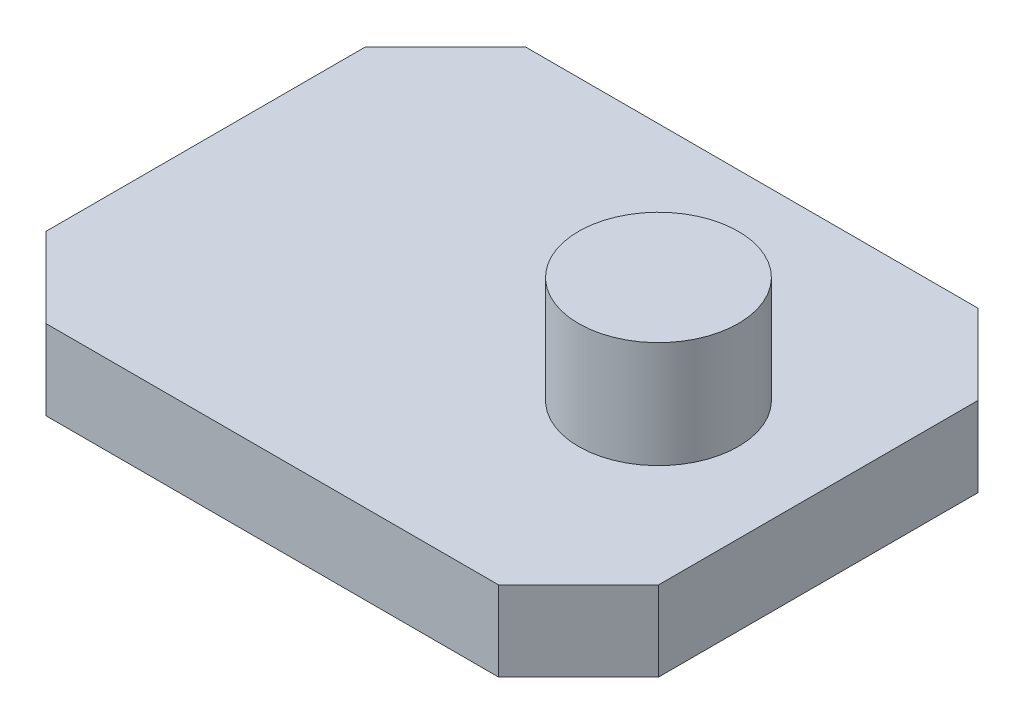
ISO-10303-21;
HEADER;
FILE_DESCRIPTION(('STEP AP214'),'2;1');
FILE_NAME('part.step','',(''),(''),'','','');
FILE_SCHEMA(('AUTOMOTIVE_DESIGN { 1 0 10303 214 1 1 1 1 }'));
ENDSEC;
DATA;
#1=APPLICATION_CONTEXT('core data for automotive mechanical design processes');
#2=APPLICATION_PROTOCOL_DEFINITION('international standard','automotive_design',2000,#1);
#3=PRODUCT_CONTEXT('',#1,'mechanical');
#4=PRODUCT('Part','Part','',(#3));
#5=PRODUCT_RELATED_PRODUCT_CATEGORY('part','',(#4));
#6=PRODUCT_DEFINITION_FORMATION('','',#4);
#7=PRODUCT_DEFINITION_CONTEXT('part definition',#1,'design');
#8=PRODUCT_DEFINITION('design','',#6,#7);
#9=PRODUCT_DEFINITION_SHAPE('','',#8);
#10=(LENGTH_UNIT() NAMED_UNIT(*) SI_UNIT(.MILLI.,.METRE.));
#11=(NAMED_UNIT(*) PLANE_ANGLE_UNIT() SI_UNIT($,.RADIAN.));
#12=(NAMED_UNIT(*) SI_UNIT($,.STERADIAN.) SOLID_ANGLE_UNIT());
#13=UNCERTAINTY_MEASURE_WITH_UNIT(LENGTH_MEASURE(1.E-05),#10,'distance_accuracy_value','');
#14=(GEOMETRIC_REPRESENTATION_CONTEXT(3) GLOBAL_UNCERTAINTY_ASSIGNED_CONTEXT((#13)) GLOBAL_UNIT_ASSIGNED_CONTEXT((#10,
#11,#12)) REPRESENTATION_CONTEXT('',''));
#15=CARTESIAN_POINT('',(0.,0.,0.));
#16=DIRECTION('',(0.,0.,1.));
#17=DIRECTION('',(1.,0.,0.));
#18=AXIS2_PLACEMENT_3D('',#15,#16,#17);
#19=CARTESIAN_POINT('',(11.5,1.5,-9.));
#20=DIRECTION('',(-1.,0.,0.));
#21=DIRECTION('',(0.,0.,1.));
#22=AXIS2_PLACEMENT_3D('',#19,#20,#21);
#23=PLANE('',#22);
#24=DIRECTION('',(0.,0.,-1.));
#25=VECTOR('',#24,1.);
#26=CARTESIAN_POINT('',(11.5,1.5,-9.));
#27=LINE('',#26,#25);
#28=CARTESIAN_POINT('',(11.5,1.5,6.));
#29=VERTEX_POINT('',#28);
#30=CARTESIAN_POINT('',(11.5,1.5,-5.99999999999999));
#31=VERTEX_POINT('',#30);
#32=EDGE_CURVE('E140',#29,#31,#27,.T.);
#33=ORIENTED_EDGE('',*,*,#32,.F.);
#34=DIRECTION('',(0.,-1.,0.));
#35=VECTOR('',#34,1.);
#36=CARTESIAN_POINT('',(11.5,1.5,6.));
#37=LINE('',#36,#35);
#38=CARTESIAN_POINT('',(11.5,-1.5,6.));
#39=VERTEX_POINT('',#38);
#40=EDGE_CURVE('E123',#29,#39,#37,.T.);
#41=ORIENTED_EDGE('',*,*,#40,.T.);
#42=DIRECTION('',(0.,0.,-1.));
#43=VECTOR('',#42,1.);
#44=CARTESIAN_POINT('',(11.5,-1.5,-9.));
#45=LINE('',#44,#43);
#46=CARTESIAN_POINT('',(11.5,-1.5,-5.99999999999999));
#47=VERTEX_POINT('',#46);
#48=EDGE_CURVE('E133',#39,#47,#45,.T.);
#49=ORIENTED_EDGE('',*,*,#48,.T.);
#50=DIRECTION('',(0.,1.,0.));
#51=VECTOR('',#50,1.);
#52=CARTESIAN_POINT('',(11.5,1.5,-5.99999999999999));
#53=LINE('',#52,#51);
#54=EDGE_CURVE('E137',#47,#31,#53,.T.);
#55=ORIENTED_EDGE('',*,*,#54,.T.);
#56=EDGE_LOOP('',(#33,#41,#49,#55));
#57=FACE_BOUND('',#56,.T.);
#58=ADVANCED_FACE('F50',(#57),#23,.F.);
#59=CARTESIAN_POINT('',(-11.5,1.5,-9.));
#60=DIRECTION('',(0.,0.,1.));
#61=DIRECTION('',(1.,0.,0.));
#62=AXIS2_PLACEMENT_3D('',#59,#60,#61);
#63=PLANE('',#62);
#64=DIRECTION('',(-1.,0.,0.));
#65=VECTOR('',#64,1.);
#66=CARTESIAN_POINT('',(-11.5,1.5,-9.));
#67=LINE('',#66,#65);
#68=CARTESIAN_POINT('',(8.49999999999999,1.5,-9.));
#69=VERTEX_POINT('',#68);
#70=CARTESIAN_POINT('',(-8.49999999999999,1.5,-9.));
#71=VERTEX_POINT('',#70);
#72=EDGE_CURVE('E215',#69,#71,#67,.T.);
#73=ORIENTED_EDGE('',*,*,#72,.F.);
#74=DIRECTION('',(0.,-1.,0.));
#75=VECTOR('',#74,1.);
#76=CARTESIAN_POINT('',(8.49999999999999,1.5,-9.));
#77=LINE('',#76,#75);
#78=CARTESIAN_POINT('',(8.49999999999999,-1.5,-9.));
#79=VERTEX_POINT('',#78);
#80=EDGE_CURVE('E195',#69,#79,#77,.T.);
#81=ORIENTED_EDGE('',*,*,#80,.T.);
#82=DIRECTION('',(-1.,0.,0.));
#83=VECTOR('',#82,1.);
#84=CARTESIAN_POINT('',(-11.5,-1.5,-9.));
#85=LINE('',#84,#83);
#86=CARTESIAN_POINT('',(-8.49999999999999,-1.5,-9.));
#87=VERTEX_POINT('',#86);
#88=EDGE_CURVE('E144',#79,#87,#85,.T.);
#89=ORIENTED_EDGE('',*,*,#88,.T.);
#90=DIRECTION('',(0.,1.,0.));
#91=VECTOR('',#90,1.);
#92=CARTESIAN_POINT('',(-8.49999999999999,1.5,-9.));
#93=LINE('',#92,#91);
#94=EDGE_CURVE('E188',#87,#71,#93,.T.);
#95=ORIENTED_EDGE('',*,*,#94,.T.);
#96=EDGE_LOOP('',(#73,#81,#89,#95));
#97=FACE_BOUND('',#96,.T.);
#98=ADVANCED_FACE('F221',(#97),#63,.F.);
#99=CARTESIAN_POINT('',(-11.5,1.5,-9.));
#100=DIRECTION('',(1.,0.,0.));
#101=DIRECTION('',(0.,0.,-1.));
#102=AXIS2_PLACEMENT_3D('',#99,#100,#101);
#103=PLANE('',#102);
#104=DIRECTION('',(0.,0.,1.));
#105=VECTOR('',#104,1.);
#106=CARTESIAN_POINT('',(-11.5,1.5,-9.));
#107=LINE('',#106,#105);
#108=CARTESIAN_POINT('',(-11.5,1.5,-6.));
#109=VERTEX_POINT('',#108);
#110=CARTESIAN_POINT('',(-11.5,1.5,5.99999999999998));
#111=VERTEX_POINT('',#110);
#112=EDGE_CURVE('E203',#109,#111,#107,.T.);
#113=ORIENTED_EDGE('',*,*,#112,.F.);
#114=DIRECTION('',(0.,-1.,0.));
#115=VECTOR('',#114,1.);
#116=CARTESIAN_POINT('',(-11.5,1.5,-6.));
#117=LINE('',#116,#115);
#118=CARTESIAN_POINT('',(-11.5,-1.5,-6.));
#119=VERTEX_POINT('',#118);
#120=EDGE_CURVE('E55',#109,#119,#117,.T.);
#121=ORIENTED_EDGE('',*,*,#120,.T.);
#122=DIRECTION('',(0.,0.,1.));
#123=VECTOR('',#122,1.);
#124=CARTESIAN_POINT('',(-11.5,-1.5,-9.));
#125=LINE('',#124,#123);
#126=CARTESIAN_POINT('',(-11.5,-1.5,5.99999999999998));
#127=VERTEX_POINT('',#126);
#128=EDGE_CURVE('E151',#119,#127,#125,.T.);
#129=ORIENTED_EDGE('',*,*,#128,.T.);
#130=DIRECTION('',(0.,1.,0.));
#131=VECTOR('',#130,1.);
#132=CARTESIAN_POINT('',(-11.5,1.5,5.99999999999998));
#133=LINE('',#132,#131);
#134=EDGE_CURVE('E62',#127,#111,#133,.T.);
#135=ORIENTED_EDGE('',*,*,#134,.T.);
#136=EDGE_LOOP('',(#113,#121,#129,#135));
#137=FACE_BOUND('',#136,.T.);
#138=ADVANCED_FACE('F199',(#137),#103,.F.);
#139=CARTESIAN_POINT('',(-11.5,1.5,9.));
#140=DIRECTION('',(0.,0.,-1.));
#141=DIRECTION('',(-1.,0.,0.));
#142=AXIS2_PLACEMENT_3D('',#139,#140,#141);
#143=PLANE('',#142);
#144=DIRECTION('',(1.,0.,0.));
#145=VECTOR('',#144,1.);
#146=CARTESIAN_POINT('',(-11.5,-1.5,9.));
#147=LINE('',#146,#145);
#148=CARTESIAN_POINT('',(-8.49999999999999,-1.5,9.));
#149=VERTEX_POINT('',#148);
#150=CARTESIAN_POINT('',(8.49999999999999,-1.5,9.));
#151=VERTEX_POINT('',#150);
#152=EDGE_CURVE('E161',#149,#151,#147,.T.);
#153=ORIENTED_EDGE('',*,*,#152,.T.);
#154=DIRECTION('',(0.,1.,0.));
#155=VECTOR('',#154,1.);
#156=CARTESIAN_POINT('',(8.49999999999999,1.5,9.));
#157=LINE('',#156,#155);
#158=CARTESIAN_POINT('',(8.49999999999999,1.5,9.));
#159=VERTEX_POINT('',#158);
#160=EDGE_CURVE('E125',#151,#159,#157,.T.);
#161=ORIENTED_EDGE('',*,*,#160,.T.);
#162=DIRECTION('',(1.,0.,0.));
#163=VECTOR('',#162,1.);
#164=CARTESIAN_POINT('',(-11.5,1.5,9.));
#165=LINE('',#164,#163);
#166=CARTESIAN_POINT('',(-8.49999999999999,1.5,9.));
#167=VERTEX_POINT('',#166);
#168=EDGE_CURVE('E156',#167,#159,#165,.T.);
#169=ORIENTED_EDGE('',*,*,#168,.F.);
#170=DIRECTION('',(0.,-1.,0.));
#171=VECTOR('',#170,1.);
#172=CARTESIAN_POINT('',(-8.49999999999999,1.5,9.));
#173=LINE('',#172,#171);
#174=EDGE_CURVE('E126',#167,#149,#173,.T.);
#175=ORIENTED_EDGE('',*,*,#174,.T.);
#176=EDGE_LOOP('',(#153,#161,#169,#175));
#177=FACE_BOUND('',#176,.T.);
#178=ADVANCED_FACE('F208',(#177),#143,.F.);
#179=CARTESIAN_POINT('',(0.,1.5,0.));
#180=DIRECTION('',(0.,1.,0.));
#181=DIRECTION('',(0.,0.,1.));
#182=AXIS2_PLACEMENT_3D('',#179,#180,#181);
#183=PLANE('',#182);
#184=CARTESIAN_POINT('',(5.5,1.5,0.));
#185=DIRECTION('',(0.,1.,0.));
#186=DIRECTION('',(0.,0.,1.));
#187=AXIS2_PLACEMENT_3D('',#184,#185,#186);
#188=CIRCLE('',#187,3.);
#189=CARTESIAN_POINT('',(5.5,1.5,3.));
#190=VERTEX_POINT('',#189);
#191=EDGE_CURVE('E11',#190,#190,#188,.T.);
#192=ORIENTED_EDGE('',*,*,#191,.F.);
#193=EDGE_LOOP('',(#192));
#194=FACE_BOUND('',#193,.T.);
#195=ORIENTED_EDGE('',*,*,#168,.T.);
#196=DIRECTION('',(-0.707106781186549,0.,0.707106781186546));
#197=VECTOR('',#196,1.);
#198=CARTESIAN_POINT('',(8.74999999999998,1.5,8.75000000000001));
#199=LINE('',#198,#197);
#200=EDGE_CURVE('E189',#159,#29,#199,.F.);
#201=ORIENTED_EDGE('',*,*,#200,.T.);
#202=ORIENTED_EDGE('',*,*,#32,.T.);
#203=DIRECTION('',(0.707106781186546,0.,0.707106781186549));
#204=VECTOR('',#203,1.);
#205=CARTESIAN_POINT('',(8.75000000000001,1.5,-8.74999999999998));
#206=LINE('',#205,#204);
#207=EDGE_CURVE('E181',#31,#69,#206,.F.);
#208=ORIENTED_EDGE('',*,*,#207,.T.);
#209=ORIENTED_EDGE('',*,*,#72,.T.);
#210=DIRECTION('',(0.707106781186549,0.,-0.707106781186546));
#211=VECTOR('',#210,1.);
#212=CARTESIAN_POINT('',(-8.74999999999998,1.5,-8.75000000000001));
#213=LINE('',#212,#211);
#214=EDGE_CURVE('E75',#71,#109,#213,.F.);
#215=ORIENTED_EDGE('',*,*,#214,.T.);
#216=ORIENTED_EDGE('',*,*,#112,.T.);
#217=DIRECTION('',(-0.707106781186546,0.,-0.707106781186549));
#218=VECTOR('',#217,1.);
#219=CARTESIAN_POINT('',(-8.75000000000001,1.5,8.74999999999998));
#220=LINE('',#219,#218);
#221=EDGE_CURVE('E176',#111,#167,#220,.F.);
#222=ORIENTED_EDGE('',*,*,#221,.T.);
#223=EDGE_LOOP('',(#195,#201,#202,#208,#209,#215,#216,#222));
#224=FACE_BOUND('',#223,.T.);
#225=ADVANCED_FACE('F217',(#194,#224),#183,.T.);
#226=CARTESIAN_POINT('',(0.,-1.5,0.));
#227=DIRECTION('',(0.,1.,0.));
#228=DIRECTION('',(0.,0.,1.));
#229=AXIS2_PLACEMENT_3D('',#226,#227,#228);
#230=PLANE('',#229);
#231=ORIENTED_EDGE('',*,*,#48,.F.);
#232=DIRECTION('',(0.707106781186549,0.,-0.707106781186546));
#233=VECTOR('',#232,1.);
#234=CARTESIAN_POINT('',(11.5,-1.5,6.));
#235=LINE('',#234,#233);
#236=EDGE_CURVE('E116',#39,#151,#235,.F.);
#237=ORIENTED_EDGE('',*,*,#236,.T.);
#238=ORIENTED_EDGE('',*,*,#152,.F.);
#239=DIRECTION('',(0.707106781186546,0.,0.707106781186549));
#240=VECTOR('',#239,1.);
#241=CARTESIAN_POINT('',(-8.49999999999999,-1.5,9.));
#242=LINE('',#241,#240);
#243=EDGE_CURVE('E139',#149,#127,#242,.F.);
#244=ORIENTED_EDGE('',*,*,#243,.T.);
#245=ORIENTED_EDGE('',*,*,#128,.F.);
#246=DIRECTION('',(-0.707106781186549,0.,0.707106781186546));
#247=VECTOR('',#246,1.);
#248=CARTESIAN_POINT('',(-11.5,-1.5,-6.));
#249=LINE('',#248,#247);
#250=EDGE_CURVE('E169',#119,#87,#249,.F.);
#251=ORIENTED_EDGE('',*,*,#250,.T.);
#252=ORIENTED_EDGE('',*,*,#88,.F.);
#253=DIRECTION('',(-0.707106781186546,0.,-0.707106781186549));
#254=VECTOR('',#253,1.);
#255=CARTESIAN_POINT('',(8.49999999999999,-1.5,-9.));
#256=LINE('',#255,#254);
#257=EDGE_CURVE('E129',#79,#47,#256,.F.);
#258=ORIENTED_EDGE('',*,*,#257,.T.);
#259=EDGE_LOOP('',(#231,#237,#238,#244,#245,#251,#252,#258));
#260=FACE_BOUND('',#259,.T.);
#261=ADVANCED_FACE('F142',(#260),#230,.F.);
#262=CARTESIAN_POINT('',(11.5,1.5,6.));
#263=DIRECTION('',(-0.707106781186546,0.,-0.707106781186549));
#264=DIRECTION('',(0.,-1.,0.));
#265=AXIS2_PLACEMENT_3D('',#262,#263,#264);
#266=PLANE('',#265);
#267=ORIENTED_EDGE('',*,*,#200,.F.);
#268=ORIENTED_EDGE('',*,*,#160,.F.);
#269=ORIENTED_EDGE('',*,*,#236,.F.);
#270=ORIENTED_EDGE('',*,*,#40,.F.);
#271=EDGE_LOOP('',(#267,#268,#269,#270));
#272=FACE_BOUND('',#271,.T.);
#273=ADVANCED_FACE('F117',(#272),#266,.F.);
#274=CARTESIAN_POINT('',(8.49999999999999,1.5,-9.));
#275=DIRECTION('',(-0.707106781186549,0.,0.707106781186546));
#276=DIRECTION('',(0.,-1.,0.));
#277=AXIS2_PLACEMENT_3D('',#274,#275,#276);
#278=PLANE('',#277);
#279=ORIENTED_EDGE('',*,*,#207,.F.);
#280=ORIENTED_EDGE('',*,*,#54,.F.);
#281=ORIENTED_EDGE('',*,*,#257,.F.);
#282=ORIENTED_EDGE('',*,*,#80,.F.);
#283=EDGE_LOOP('',(#279,#280,#281,#282));
#284=FACE_BOUND('',#283,.T.);
#285=ADVANCED_FACE('F225',(#284),#278,.F.);
#286=CARTESIAN_POINT('',(-11.5,1.5,-6.));
#287=DIRECTION('',(0.707106781186546,0.,0.707106781186549));
#288=DIRECTION('',(0.,-1.,0.));
#289=AXIS2_PLACEMENT_3D('',#286,#287,#288);
#290=PLANE('',#289);
#291=ORIENTED_EDGE('',*,*,#214,.F.);
#292=ORIENTED_EDGE('',*,*,#94,.F.);
#293=ORIENTED_EDGE('',*,*,#250,.F.);
#294=ORIENTED_EDGE('',*,*,#120,.F.);
#295=EDGE_LOOP('',(#291,#292,#293,#294));
#296=FACE_BOUND('',#295,.T.);
#297=ADVANCED_FACE('F229',(#296),#290,.F.);
#298=CARTESIAN_POINT('',(-8.49999999999999,1.5,9.));
#299=DIRECTION('',(0.707106781186549,0.,-0.707106781186546));
#300=DIRECTION('',(0.,-1.,0.));
#301=AXIS2_PLACEMENT_3D('',#298,#299,#300);
#302=PLANE('',#301);
#303=ORIENTED_EDGE('',*,*,#221,.F.);
#304=ORIENTED_EDGE('',*,*,#134,.F.);
#305=ORIENTED_EDGE('',*,*,#243,.F.);
#306=ORIENTED_EDGE('',*,*,#174,.F.);
#307=EDGE_LOOP('',(#303,#304,#305,#306));
#308=FACE_BOUND('',#307,.T.);
#309=ADVANCED_FACE('F49',(#308),#302,.F.);
#310=CARTESIAN_POINT('',(5.5,5.5,0.));
#311=DIRECTION('',(0.,-1.,0.));
#312=DIRECTION('',(0.,0.,-1.));
#313=AXIS2_PLACEMENT_3D('',#310,#311,#312);
#314=CYLINDRICAL_SURFACE('',#313,3.);
#315=CARTESIAN_POINT('',(5.5,5.5,0.));
#316=DIRECTION('',(0.,1.,0.));
#317=DIRECTION('',(0.,0.,1.));
#318=AXIS2_PLACEMENT_3D('',#315,#316,#317);
#319=CIRCLE('',#318,3.);
#320=CARTESIAN_POINT('',(5.5,5.5,3.));
#321=VERTEX_POINT('',#320);
#322=EDGE_CURVE('E148',#321,#321,#319,.T.);
#323=ORIENTED_EDGE('',*,*,#322,.F.);
#324=EDGE_LOOP('',(#323));
#325=FACE_BOUND('',#324,.T.);
#326=ORIENTED_EDGE('',*,*,#191,.T.);
#327=EDGE_LOOP('',(#326));
#328=FACE_BOUND('',#327,.T.);
#329=ADVANCED_FACE('F235',(#325,#328),#314,.T.);
#330=CARTESIAN_POINT('',(5.5,5.5,0.));
#331=DIRECTION('',(0.,1.,0.));
#332=DIRECTION('',(0.,0.,1.));
#333=AXIS2_PLACEMENT_3D('',#330,#331,#332);
#334=PLANE('',#333);
#335=ORIENTED_EDGE('',*,*,#322,.T.);
#336=EDGE_LOOP('',(#335));
#337=FACE_BOUND('',#336,.T.);
#338=ADVANCED_FACE('F316',(#337),#334,.T.);
#339=CLOSED_SHELL('',(#58,#98,#138,#178,#225,#261,#273,#285,#297,#309,#329,#338));
#340=MANIFOLD_SOLID_BREP('B2',#339);
#341=ADVANCED_BREP_SHAPE_REPRESENTATION('',(#18,#340),#14);
#342=SHAPE_DEFINITION_REPRESENTATION(#9,#341);
ENDSEC;
END-ISO-10303-21;
